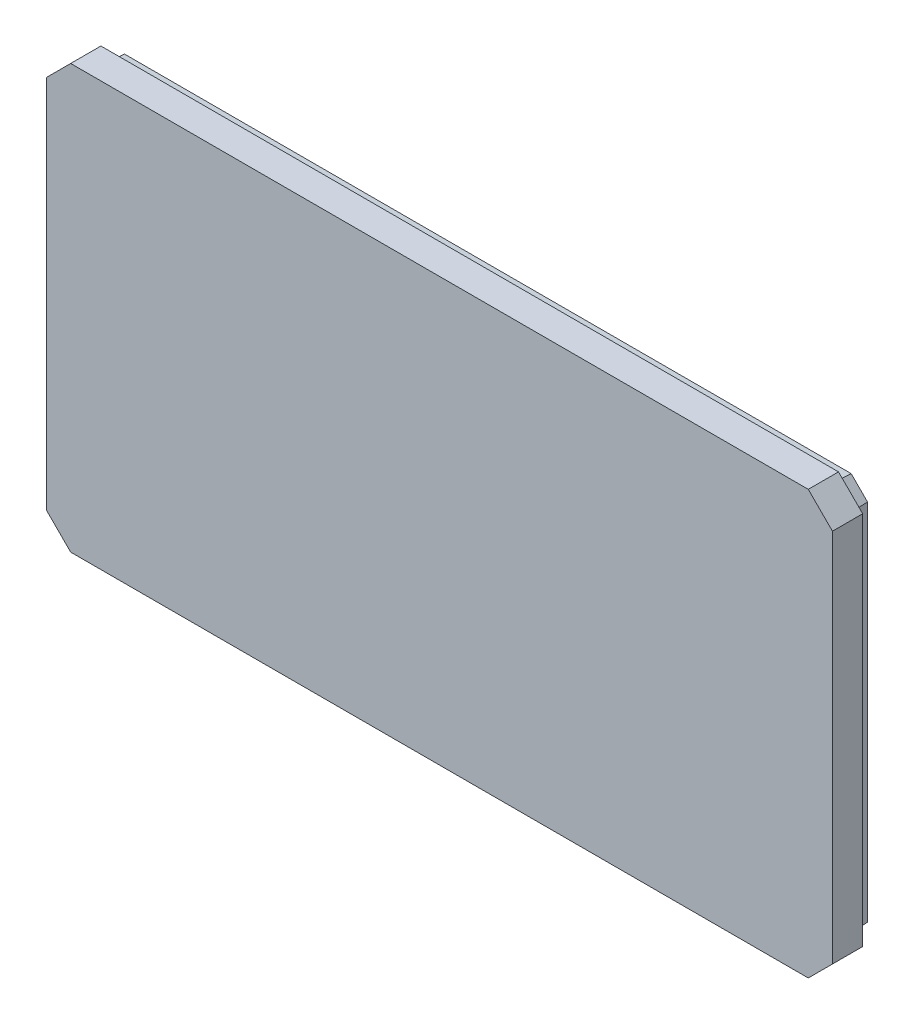
ISO-10303-21;
HEADER;
FILE_DESCRIPTION(('STEP AP214'),'2;1');
FILE_NAME('part.step','',(''),(''),'','','');
FILE_SCHEMA(('AUTOMOTIVE_DESIGN { 1 0 10303 214 1 1 1 1 }'));
ENDSEC;
DATA;
#1=APPLICATION_CONTEXT('core data for automotive mechanical design processes');
#2=APPLICATION_PROTOCOL_DEFINITION('international standard','automotive_design',2000,#1);
#3=PRODUCT_CONTEXT('',#1,'mechanical');
#4=PRODUCT('Part','Part','',(#3));
#5=PRODUCT_RELATED_PRODUCT_CATEGORY('part','',(#4));
#6=PRODUCT_DEFINITION_FORMATION('','',#4);
#7=PRODUCT_DEFINITION_CONTEXT('part definition',#1,'design');
#8=PRODUCT_DEFINITION('design','',#6,#7);
#9=PRODUCT_DEFINITION_SHAPE('','',#8);
#10=(LENGTH_UNIT() NAMED_UNIT(*) SI_UNIT(.MILLI.,.METRE.));
#11=(NAMED_UNIT(*) PLANE_ANGLE_UNIT() SI_UNIT($,.RADIAN.));
#12=(NAMED_UNIT(*) SI_UNIT($,.STERADIAN.) SOLID_ANGLE_UNIT());
#13=UNCERTAINTY_MEASURE_WITH_UNIT(LENGTH_MEASURE(1.E-05),#10,'distance_accuracy_value','');
#14=(GEOMETRIC_REPRESENTATION_CONTEXT(3) GLOBAL_UNCERTAINTY_ASSIGNED_CONTEXT((#13)) GLOBAL_UNIT_ASSIGNED_CONTEXT((#10,
#11,#12)) REPRESENTATION_CONTEXT('',''));
#15=CARTESIAN_POINT('',(0.,0.,0.));
#16=DIRECTION('',(0.,0.,1.));
#17=DIRECTION('',(1.,0.,0.));
#18=AXIS2_PLACEMENT_3D('',#15,#16,#17);
#19=CARTESIAN_POINT('',(-31.5,0.,0.));
#20=DIRECTION('',(-0.997785157856609,0.,-0.0665190105237669));
#21=DIRECTION('',(0.,1.,0.));
#22=AXIS2_PLACEMENT_3D('',#19,#20,#21);
#23=PLANE('',#22);
#24=DIRECTION('',(0.,-1.,0.));
#25=VECTOR('',#24,1.);
#26=CARTESIAN_POINT('',(-31.5,0.,0.));
#27=LINE('',#26,#25);
#28=CARTESIAN_POINT('',(-31.5,-1.05,0.));
#29=VERTEX_POINT('',#28);
#30=CARTESIAN_POINT('',(-31.5,-15.0857864376269,0.));
#31=VERTEX_POINT('',#30);
#32=EDGE_CURVE('E347',#29,#31,#27,.T.);
#33=ORIENTED_EDGE('',*,*,#32,.F.);
#34=DIRECTION('',(0.0665190105237669,0.,-0.997785157856609));
#35=VECTOR('',#34,1.);
#36=CARTESIAN_POINT('',(-31.5,-1.05,0.));
#37=LINE('',#36,#35);
#38=CARTESIAN_POINT('',(-31.46,-1.05,-0.6));
#39=VERTEX_POINT('',#38);
#40=EDGE_CURVE('E11',#29,#39,#37,.T.);
#41=ORIENTED_EDGE('',*,*,#40,.T.);
#42=DIRECTION('',(0.,-1.,0.));
#43=VECTOR('',#42,1.);
#44=CARTESIAN_POINT('',(-31.46,0.,-0.6));
#45=LINE('',#44,#43);
#46=CARTESIAN_POINT('',(-31.46,1.05,-0.6));
#47=VERTEX_POINT('',#46);
#48=EDGE_CURVE('E491',#47,#39,#45,.T.);
#49=ORIENTED_EDGE('',*,*,#48,.F.);
#50=DIRECTION('',(-0.0665190105237669,0.,0.997785157856609));
#51=VECTOR('',#50,1.);
#52=CARTESIAN_POINT('',(-31.5,1.05,0.));
#53=LINE('',#52,#51);
#54=CARTESIAN_POINT('',(-31.5,1.05,0.));
#55=VERTEX_POINT('',#54);
#56=EDGE_CURVE('E43',#47,#55,#53,.T.);
#57=ORIENTED_EDGE('',*,*,#56,.T.);
#58=CARTESIAN_POINT('',(-31.5,15.0857864376269,0.));
#59=VERTEX_POINT('',#58);
#60=EDGE_CURVE('E368',#59,#55,#27,.T.);
#61=ORIENTED_EDGE('',*,*,#60,.F.);
#62=DIRECTION('',(0.0664937752057111,-0.0275426235035928,-0.997406628085773));
#63=VECTOR('',#62,1.);
#64=CARTESIAN_POINT('',(-31.4723716943642,15.0743424187271,-0.414424584536984));
#65=LINE('',#64,#63);
#66=CARTESIAN_POINT('',(-31.4,15.0443650813896,-1.5));
#67=VERTEX_POINT('',#66);
#68=EDGE_CURVE('E475',#67,#59,#65,.F.);
#69=ORIENTED_EDGE('',*,*,#68,.F.);
#70=DIRECTION('',(0.,1.,0.));
#71=VECTOR('',#70,1.);
#72=CARTESIAN_POINT('',(-31.4,15.0857864376269,-1.5));
#73=LINE('',#72,#71);
#74=CARTESIAN_POINT('',(-31.4,-15.0443650813896,-1.5));
#75=VERTEX_POINT('',#74);
#76=EDGE_CURVE('E456',#75,#67,#73,.T.);
#77=ORIENTED_EDGE('',*,*,#76,.F.);
#78=DIRECTION('',(0.0664937752057111,0.0275426235035949,-0.997406628085773));
#79=VECTOR('',#78,1.);
#80=CARTESIAN_POINT('',(-31.4787435185445,-15.0769817147197,-0.31884722183174));
#81=LINE('',#80,#79);
#82=EDGE_CURVE('E481',#75,#31,#81,.F.);
#83=ORIENTED_EDGE('',*,*,#82,.T.);
#84=EDGE_LOOP('',(#33,#41,#49,#57,#61,#69,#77,#83));
#85=FACE_BOUND('',#84,.T.);
#86=ADVANCED_FACE('F35',(#85),#23,.T.);
#87=CARTESIAN_POINT('',(31.5,0.,0.));
#88=DIRECTION('',(0.997785157856609,0.,-0.0665190105237669));
#89=DIRECTION('',(0.,-1.,0.));
#90=AXIS2_PLACEMENT_3D('',#87,#88,#89);
#91=PLANE('',#90);
#92=DIRECTION('',(0.,1.,0.));
#93=VECTOR('',#92,1.);
#94=CARTESIAN_POINT('',(31.46,0.,-0.6));
#95=LINE('',#94,#93);
#96=CARTESIAN_POINT('',(31.46,-1.05,-0.6));
#97=VERTEX_POINT('',#96);
#98=CARTESIAN_POINT('',(31.46,1.05,-0.6));
#99=VERTEX_POINT('',#98);
#100=EDGE_CURVE('E465',#97,#99,#95,.T.);
#101=ORIENTED_EDGE('',*,*,#100,.F.);
#102=DIRECTION('',(0.0665190105237669,0.,0.997785157856609));
#103=VECTOR('',#102,1.);
#104=CARTESIAN_POINT('',(31.5,-1.05,0.));
#105=LINE('',#104,#103);
#106=CARTESIAN_POINT('',(31.5,-1.05,0.));
#107=VERTEX_POINT('',#106);
#108=EDGE_CURVE('E249',#97,#107,#105,.T.);
#109=ORIENTED_EDGE('',*,*,#108,.T.);
#110=DIRECTION('',(0.,1.,0.));
#111=VECTOR('',#110,1.);
#112=CARTESIAN_POINT('',(31.5,0.,0.));
#113=LINE('',#112,#111);
#114=CARTESIAN_POINT('',(31.5,-15.0857864376269,0.));
#115=VERTEX_POINT('',#114);
#116=EDGE_CURVE('E378',#115,#107,#113,.T.);
#117=ORIENTED_EDGE('',*,*,#116,.F.);
#118=DIRECTION('',(0.0664937752057111,-0.0275426235035997,0.997406628085773));
#119=VECTOR('',#118,1.);
#120=CARTESIAN_POINT('',(31.4787435185446,-15.0769817147197,-0.318847221831706));
#121=LINE('',#120,#119);
#122=CARTESIAN_POINT('',(31.4,-15.0443650813896,-1.5));
#123=VERTEX_POINT('',#122);
#124=EDGE_CURVE('E472',#115,#123,#121,.F.);
#125=ORIENTED_EDGE('',*,*,#124,.T.);
#126=DIRECTION('',(0.,-1.,0.));
#127=VECTOR('',#126,1.);
#128=CARTESIAN_POINT('',(31.4,-15.0857864376269,-1.5));
#129=LINE('',#128,#127);
#130=CARTESIAN_POINT('',(31.4,15.0443650813896,-1.5));
#131=VERTEX_POINT('',#130);
#132=EDGE_CURVE('E452',#131,#123,#129,.T.);
#133=ORIENTED_EDGE('',*,*,#132,.F.);
#134=DIRECTION('',(0.0664937752057111,0.0275426235035949,0.997406628085773));
#135=VECTOR('',#134,1.);
#136=CARTESIAN_POINT('',(31.4723716943642,15.0743424187272,-0.414424584537016));
#137=LINE('',#136,#135);
#138=CARTESIAN_POINT('',(31.5,15.0857864376269,0.));
#139=VERTEX_POINT('',#138);
#140=EDGE_CURVE('E467',#139,#131,#137,.F.);
#141=ORIENTED_EDGE('',*,*,#140,.F.);
#142=CARTESIAN_POINT('',(31.5,1.05,0.));
#143=VERTEX_POINT('',#142);
#144=EDGE_CURVE('E377',#143,#139,#113,.T.);
#145=ORIENTED_EDGE('',*,*,#144,.F.);
#146=DIRECTION('',(-0.0665190105237669,0.,-0.997785157856609));
#147=VECTOR('',#146,1.);
#148=CARTESIAN_POINT('',(31.5,1.05,0.));
#149=LINE('',#148,#147);
#150=EDGE_CURVE('E487',#143,#99,#149,.T.);
#151=ORIENTED_EDGE('',*,*,#150,.T.);
#152=EDGE_LOOP('',(#101,#109,#117,#125,#133,#141,#145,#151));
#153=FACE_BOUND('',#152,.T.);
#154=ADVANCED_FACE('F523',(#153),#91,.T.);
#155=CARTESIAN_POINT('',(-32.5,17.5,2.5));
#156=DIRECTION('',(0.,1.,0.));
#157=DIRECTION('',(0.,0.,1.));
#158=AXIS2_PLACEMENT_3D('',#155,#156,#157);
#159=PLANE('',#158);
#160=DIRECTION('',(1.,0.,0.));
#161=VECTOR('',#160,1.);
#162=CARTESIAN_POINT('',(-32.5,17.5,0.));
#163=LINE('',#162,#161);
#164=CARTESIAN_POINT('',(-30.5,17.5,0.));
#165=VERTEX_POINT('',#164);
#166=CARTESIAN_POINT('',(30.5,17.5,0.));
#167=VERTEX_POINT('',#166);
#168=EDGE_CURVE('E388',#165,#167,#163,.T.);
#169=ORIENTED_EDGE('',*,*,#168,.F.);
#170=DIRECTION('',(0.,0.,1.));
#171=VECTOR('',#170,1.);
#172=CARTESIAN_POINT('',(-30.5,17.5,2.5));
#173=LINE('',#172,#171);
#174=CARTESIAN_POINT('',(-30.5,17.5,2.5));
#175=VERTEX_POINT('',#174);
#176=EDGE_CURVE('E441',#165,#175,#173,.T.);
#177=ORIENTED_EDGE('',*,*,#176,.T.);
#178=DIRECTION('',(1.,0.,0.));
#179=VECTOR('',#178,1.);
#180=CARTESIAN_POINT('',(-32.5,17.5,2.5));
#181=LINE('',#180,#179);
#182=CARTESIAN_POINT('',(30.5,17.5,2.5));
#183=VERTEX_POINT('',#182);
#184=EDGE_CURVE('E389',#175,#183,#181,.T.);
#185=ORIENTED_EDGE('',*,*,#184,.T.);
#186=DIRECTION('',(0.,0.,-1.));
#187=VECTOR('',#186,1.);
#188=CARTESIAN_POINT('',(30.5,17.5,0.));
#189=LINE('',#188,#187);
#190=EDGE_CURVE('E438',#183,#167,#189,.T.);
#191=ORIENTED_EDGE('',*,*,#190,.T.);
#192=EDGE_LOOP('',(#169,#177,#185,#191));
#193=FACE_BOUND('',#192,.T.);
#194=ADVANCED_FACE('F558',(#193),#159,.T.);
#195=CARTESIAN_POINT('',(-32.5,-17.5,2.5));
#196=DIRECTION('',(-1.,0.,0.));
#197=DIRECTION('',(0.,0.,1.));
#198=AXIS2_PLACEMENT_3D('',#195,#196,#197);
#199=PLANE('',#198);
#200=DIRECTION('',(0.,1.,0.));
#201=VECTOR('',#200,1.);
#202=CARTESIAN_POINT('',(-32.5,-17.5,0.));
#203=LINE('',#202,#201);
#204=CARTESIAN_POINT('',(-32.5,-15.5,0.));
#205=VERTEX_POINT('',#204);
#206=CARTESIAN_POINT('',(-32.5,15.5,0.));
#207=VERTEX_POINT('',#206);
#208=EDGE_CURVE('E393',#205,#207,#203,.T.);
#209=ORIENTED_EDGE('',*,*,#208,.F.);
#210=DIRECTION('',(0.,0.,1.));
#211=VECTOR('',#210,1.);
#212=CARTESIAN_POINT('',(-32.5,-15.5,2.5));
#213=LINE('',#212,#211);
#214=CARTESIAN_POINT('',(-32.5,-15.5,2.5));
#215=VERTEX_POINT('',#214);
#216=EDGE_CURVE('E428',#205,#215,#213,.T.);
#217=ORIENTED_EDGE('',*,*,#216,.T.);
#218=DIRECTION('',(0.,1.,0.));
#219=VECTOR('',#218,1.);
#220=CARTESIAN_POINT('',(-32.5,-17.5,2.5));
#221=LINE('',#220,#219);
#222=CARTESIAN_POINT('',(-32.5,15.5,2.5));
#223=VERTEX_POINT('',#222);
#224=EDGE_CURVE('E399',#215,#223,#221,.T.);
#225=ORIENTED_EDGE('',*,*,#224,.T.);
#226=DIRECTION('',(0.,0.,-1.));
#227=VECTOR('',#226,1.);
#228=CARTESIAN_POINT('',(-32.5,15.5,2.5));
#229=LINE('',#228,#227);
#230=EDGE_CURVE('E425',#223,#207,#229,.T.);
#231=ORIENTED_EDGE('',*,*,#230,.T.);
#232=EDGE_LOOP('',(#209,#217,#225,#231));
#233=FACE_BOUND('',#232,.T.);
#234=ADVANCED_FACE('F860',(#233),#199,.T.);
#235=CARTESIAN_POINT('',(-32.5,-17.5,2.5));
#236=DIRECTION('',(0.,1.,0.));
#237=DIRECTION('',(0.,0.,1.));
#238=AXIS2_PLACEMENT_3D('',#235,#236,#237);
#239=PLANE('',#238);
#240=DIRECTION('',(1.,0.,0.));
#241=VECTOR('',#240,1.);
#242=CARTESIAN_POINT('',(-32.5,-17.5,2.5));
#243=LINE('',#242,#241);
#244=CARTESIAN_POINT('',(-30.5,-17.5,2.5));
#245=VERTEX_POINT('',#244);
#246=CARTESIAN_POINT('',(30.5,-17.5,2.5));
#247=VERTEX_POINT('',#246);
#248=EDGE_CURVE('E396',#245,#247,#243,.T.);
#249=ORIENTED_EDGE('',*,*,#248,.F.);
#250=DIRECTION('',(0.,0.,-1.));
#251=VECTOR('',#250,1.);
#252=CARTESIAN_POINT('',(-30.5,-17.5,0.));
#253=LINE('',#252,#251);
#254=CARTESIAN_POINT('',(-30.5,-17.5,0.));
#255=VERTEX_POINT('',#254);
#256=EDGE_CURVE('E414',#245,#255,#253,.T.);
#257=ORIENTED_EDGE('',*,*,#256,.T.);
#258=DIRECTION('',(1.,0.,0.));
#259=VECTOR('',#258,1.);
#260=CARTESIAN_POINT('',(-32.5,-17.5,0.));
#261=LINE('',#260,#259);
#262=CARTESIAN_POINT('',(30.5,-17.5,0.));
#263=VERTEX_POINT('',#262);
#264=EDGE_CURVE('E408',#255,#263,#261,.T.);
#265=ORIENTED_EDGE('',*,*,#264,.T.);
#266=DIRECTION('',(0.,0.,1.));
#267=VECTOR('',#266,1.);
#268=CARTESIAN_POINT('',(30.5,-17.5,2.5));
#269=LINE('',#268,#267);
#270=EDGE_CURVE('E402',#263,#247,#269,.T.);
#271=ORIENTED_EDGE('',*,*,#270,.T.);
#272=EDGE_LOOP('',(#249,#257,#265,#271));
#273=FACE_BOUND('',#272,.T.);
#274=ADVANCED_FACE('F599',(#273),#239,.F.);
#275=CARTESIAN_POINT('',(32.5,-17.5,2.5));
#276=DIRECTION('',(-1.,0.,0.));
#277=DIRECTION('',(0.,0.,1.));
#278=AXIS2_PLACEMENT_3D('',#275,#276,#277);
#279=PLANE('',#278);
#280=DIRECTION('',(0.,1.,0.));
#281=VECTOR('',#280,1.);
#282=CARTESIAN_POINT('',(32.5,-17.5,0.));
#283=LINE('',#282,#281);
#284=CARTESIAN_POINT('',(32.5,-15.5,0.));
#285=VERTEX_POINT('',#284);
#286=CARTESIAN_POINT('',(32.5,15.5,0.));
#287=VERTEX_POINT('',#286);
#288=EDGE_CURVE('E405',#285,#287,#283,.T.);
#289=ORIENTED_EDGE('',*,*,#288,.T.);
#290=DIRECTION('',(0.,0.,1.));
#291=VECTOR('',#290,1.);
#292=CARTESIAN_POINT('',(32.5,15.5,2.5));
#293=LINE('',#292,#291);
#294=CARTESIAN_POINT('',(32.5,15.5,2.5));
#295=VERTEX_POINT('',#294);
#296=EDGE_CURVE('E446',#287,#295,#293,.T.);
#297=ORIENTED_EDGE('',*,*,#296,.T.);
#298=DIRECTION('',(0.,1.,0.));
#299=VECTOR('',#298,1.);
#300=CARTESIAN_POINT('',(32.5,-17.5,2.5));
#301=LINE('',#300,#299);
#302=CARTESIAN_POINT('',(32.5,-15.5,2.5));
#303=VERTEX_POINT('',#302);
#304=EDGE_CURVE('E392',#303,#295,#301,.T.);
#305=ORIENTED_EDGE('',*,*,#304,.F.);
#306=DIRECTION('',(0.,0.,-1.));
#307=VECTOR('',#306,1.);
#308=CARTESIAN_POINT('',(32.5,-15.5,2.5));
#309=LINE('',#308,#307);
#310=EDGE_CURVE('E443',#303,#285,#309,.T.);
#311=ORIENTED_EDGE('',*,*,#310,.T.);
#312=EDGE_LOOP('',(#289,#297,#305,#311));
#313=FACE_BOUND('',#312,.T.);
#314=ADVANCED_FACE('F594',(#313),#279,.F.);
#315=CARTESIAN_POINT('',(0.,0.,2.5));
#316=DIRECTION('',(0.,0.,1.));
#317=DIRECTION('',(1.,0.,0.));
#318=AXIS2_PLACEMENT_3D('',#315,#316,#317);
#319=PLANE('',#318);
#320=ORIENTED_EDGE('',*,*,#224,.F.);
#321=DIRECTION('',(0.707106781186546,-0.707106781186549,0.));
#322=VECTOR('',#321,1.);
#323=CARTESIAN_POINT('',(-24.,-24.,2.5));
#324=LINE('',#323,#322);
#325=EDGE_CURVE('E436',#215,#245,#324,.T.);
#326=ORIENTED_EDGE('',*,*,#325,.T.);
#327=ORIENTED_EDGE('',*,*,#248,.T.);
#328=DIRECTION('',(-0.707106781186548,-0.707106781186548,0.));
#329=VECTOR('',#328,1.);
#330=CARTESIAN_POINT('',(24.,-24.,2.5));
#331=LINE('',#330,#329);
#332=EDGE_CURVE('E430',#247,#303,#331,.F.);
#333=ORIENTED_EDGE('',*,*,#332,.T.);
#334=ORIENTED_EDGE('',*,*,#304,.T.);
#335=DIRECTION('',(-0.707106781186545,0.70710678118655,0.));
#336=VECTOR('',#335,1.);
#337=CARTESIAN_POINT('',(24.0000000000001,23.9999999999999,2.5));
#338=LINE('',#337,#336);
#339=EDGE_CURVE('E432',#295,#183,#338,.T.);
#340=ORIENTED_EDGE('',*,*,#339,.T.);
#341=ORIENTED_EDGE('',*,*,#184,.F.);
#342=DIRECTION('',(0.707106781186549,0.707106781186546,0.));
#343=VECTOR('',#342,1.);
#344=CARTESIAN_POINT('',(-23.9999999999999,24.,2.5));
#345=LINE('',#344,#343);
#346=EDGE_CURVE('E434',#175,#223,#345,.F.);
#347=ORIENTED_EDGE('',*,*,#346,.T.);
#348=EDGE_LOOP('',(#320,#326,#327,#333,#334,#340,#341,#347));
#349=FACE_BOUND('',#348,.T.);
#350=ADVANCED_FACE('F584',(#349),#319,.T.);
#351=CARTESIAN_POINT('',(0.,0.,0.));
#352=DIRECTION('',(0.,0.,1.));
#353=DIRECTION('',(1.,0.,0.));
#354=AXIS2_PLACEMENT_3D('',#351,#352,#353);
#355=PLANE('',#354);
#356=ORIENTED_EDGE('',*,*,#116,.T.);
#357=DIRECTION('',(-1.,0.,0.));
#358=VECTOR('',#357,1.);
#359=CARTESIAN_POINT('',(30.95,-1.05,0.));
#360=LINE('',#359,#358);
#361=CARTESIAN_POINT('',(30.95,-1.05,0.));
#362=VERTEX_POINT('',#361);
#363=EDGE_CURVE('E270',#107,#362,#360,.T.);
#364=ORIENTED_EDGE('',*,*,#363,.T.);
#365=DIRECTION('',(0.,1.,0.));
#366=VECTOR('',#365,1.);
#367=CARTESIAN_POINT('',(30.95,-1.05,0.));
#368=LINE('',#367,#366);
#369=CARTESIAN_POINT('',(30.95,1.05,0.));
#370=VERTEX_POINT('',#369);
#371=EDGE_CURVE('E259',#362,#370,#368,.T.);
#372=ORIENTED_EDGE('',*,*,#371,.T.);
#373=DIRECTION('',(1.,0.,0.));
#374=VECTOR('',#373,1.);
#375=CARTESIAN_POINT('',(30.95,1.05,0.));
#376=LINE('',#375,#374);
#377=EDGE_CURVE('E57',#370,#143,#376,.T.);
#378=ORIENTED_EDGE('',*,*,#377,.T.);
#379=ORIENTED_EDGE('',*,*,#144,.T.);
#380=DIRECTION('',(-0.707106781186545,0.70710678118655,0.));
#381=VECTOR('',#380,1.);
#382=CARTESIAN_POINT('',(23.2928932188135,23.2928932188134,0.));
#383=LINE('',#382,#381);
#384=CARTESIAN_POINT('',(30.0857864376269,16.5,0.));
#385=VERTEX_POINT('',#384);
#386=EDGE_CURVE('E381',#139,#385,#383,.T.);
#387=ORIENTED_EDGE('',*,*,#386,.T.);
#388=DIRECTION('',(-1.,0.,0.));
#389=VECTOR('',#388,1.);
#390=CARTESIAN_POINT('',(0.,16.5,0.));
#391=LINE('',#390,#389);
#392=CARTESIAN_POINT('',(-30.0857864376269,16.5,0.));
#393=VERTEX_POINT('',#392);
#394=EDGE_CURVE('E384',#385,#393,#391,.T.);
#395=ORIENTED_EDGE('',*,*,#394,.T.);
#396=DIRECTION('',(-0.707106781186549,-0.707106781186546,0.));
#397=VECTOR('',#396,1.);
#398=CARTESIAN_POINT('',(-23.2928932188134,23.2928932188135,0.));
#399=LINE('',#398,#397);
#400=EDGE_CURVE('E386',#393,#59,#399,.T.);
#401=ORIENTED_EDGE('',*,*,#400,.T.);
#402=ORIENTED_EDGE('',*,*,#60,.T.);
#403=DIRECTION('',(1.,0.,0.));
#404=VECTOR('',#403,1.);
#405=CARTESIAN_POINT('',(-32.05,1.05,0.));
#406=LINE('',#405,#404);
#407=CARTESIAN_POINT('',(-30.95,1.05,0.));
#408=VERTEX_POINT('',#407);
#409=EDGE_CURVE('E280',#55,#408,#406,.T.);
#410=ORIENTED_EDGE('',*,*,#409,.T.);
#411=DIRECTION('',(0.,-1.,0.));
#412=VECTOR('',#411,1.);
#413=CARTESIAN_POINT('',(-30.95,-1.05,0.));
#414=LINE('',#413,#412);
#415=CARTESIAN_POINT('',(-30.95,-1.05,0.));
#416=VERTEX_POINT('',#415);
#417=EDGE_CURVE('E286',#408,#416,#414,.T.);
#418=ORIENTED_EDGE('',*,*,#417,.T.);
#419=DIRECTION('',(-1.,0.,0.));
#420=VECTOR('',#419,1.);
#421=CARTESIAN_POINT('',(-32.05,-1.05,0.));
#422=LINE('',#421,#420);
#423=EDGE_CURVE('E50',#416,#29,#422,.T.);
#424=ORIENTED_EDGE('',*,*,#423,.T.);
#425=ORIENTED_EDGE('',*,*,#32,.T.);
#426=DIRECTION('',(0.707106781186546,-0.707106781186549,0.));
#427=VECTOR('',#426,1.);
#428=CARTESIAN_POINT('',(-23.2928932188135,-23.2928932188134,0.));
#429=LINE('',#428,#427);
#430=CARTESIAN_POINT('',(-30.0857864376269,-16.5,0.));
#431=VERTEX_POINT('',#430);
#432=EDGE_CURVE('E371',#31,#431,#429,.T.);
#433=ORIENTED_EDGE('',*,*,#432,.T.);
#434=DIRECTION('',(1.,0.,0.));
#435=VECTOR('',#434,1.);
#436=CARTESIAN_POINT('',(0.,-16.5,0.));
#437=LINE('',#436,#435);
#438=CARTESIAN_POINT('',(30.0857864376269,-16.5,0.));
#439=VERTEX_POINT('',#438);
#440=EDGE_CURVE('E373',#431,#439,#437,.T.);
#441=ORIENTED_EDGE('',*,*,#440,.T.);
#442=DIRECTION('',(0.707106781186548,0.707106781186548,0.));
#443=VECTOR('',#442,1.);
#444=CARTESIAN_POINT('',(23.2928932188135,-23.2928932188135,0.));
#445=LINE('',#444,#443);
#446=EDGE_CURVE('E375',#439,#115,#445,.T.);
#447=ORIENTED_EDGE('',*,*,#446,.T.);
#448=EDGE_LOOP('',(#356,#364,#372,#378,#379,#387,#395,#401,#402,#410,#418,#424,#425,#433,#441,#447));
#449=FACE_BOUND('',#448,.T.);
#450=ORIENTED_EDGE('',*,*,#264,.F.);
#451=DIRECTION('',(-0.707106781186546,0.707106781186549,0.));
#452=VECTOR('',#451,1.);
#453=CARTESIAN_POINT('',(-30.5,-17.5,0.));
#454=LINE('',#453,#452);
#455=EDGE_CURVE('E423',#255,#205,#454,.T.);
#456=ORIENTED_EDGE('',*,*,#455,.T.);
#457=ORIENTED_EDGE('',*,*,#208,.T.);
#458=DIRECTION('',(-0.707106781186549,-0.707106781186546,0.));
#459=VECTOR('',#458,1.);
#460=CARTESIAN_POINT('',(-32.5,15.5,0.));
#461=LINE('',#460,#459);
#462=EDGE_CURVE('E421',#207,#165,#461,.F.);
#463=ORIENTED_EDGE('',*,*,#462,.T.);
#464=ORIENTED_EDGE('',*,*,#168,.T.);
#465=DIRECTION('',(0.707106781186545,-0.70710678118655,0.));
#466=VECTOR('',#465,1.);
#467=CARTESIAN_POINT('',(30.5,17.5,0.));
#468=LINE('',#467,#466);
#469=EDGE_CURVE('E419',#167,#287,#468,.T.);
#470=ORIENTED_EDGE('',*,*,#469,.T.);
#471=ORIENTED_EDGE('',*,*,#288,.F.);
#472=DIRECTION('',(0.707106781186548,0.707106781186548,0.));
#473=VECTOR('',#472,1.);
#474=CARTESIAN_POINT('',(32.5,-15.5,0.));
#475=LINE('',#474,#473);
#476=EDGE_CURVE('E417',#285,#263,#475,.F.);
#477=ORIENTED_EDGE('',*,*,#476,.T.);
#478=EDGE_LOOP('',(#450,#456,#457,#463,#464,#470,#471,#477));
#479=FACE_BOUND('',#478,.T.);
#480=ADVANCED_FACE('F500',(#449,#479),#355,.F.);
#481=CARTESIAN_POINT('',(-30.5,-17.5,2.5));
#482=DIRECTION('',(-0.707106781186549,-0.707106781186546,0.));
#483=DIRECTION('',(0.,0.,1.));
#484=AXIS2_PLACEMENT_3D('',#481,#482,#483);
#485=PLANE('',#484);
#486=ORIENTED_EDGE('',*,*,#325,.F.);
#487=ORIENTED_EDGE('',*,*,#216,.F.);
#488=ORIENTED_EDGE('',*,*,#455,.F.);
#489=ORIENTED_EDGE('',*,*,#256,.F.);
#490=EDGE_LOOP('',(#486,#487,#488,#489));
#491=FACE_BOUND('',#490,.T.);
#492=ADVANCED_FACE('F583',(#491),#485,.T.);
#493=CARTESIAN_POINT('',(-32.5,15.5,2.5));
#494=DIRECTION('',(0.707106781186546,-0.707106781186549,0.));
#495=DIRECTION('',(0.,0.,-1.));
#496=AXIS2_PLACEMENT_3D('',#493,#494,#495);
#497=PLANE('',#496);
#498=ORIENTED_EDGE('',*,*,#346,.F.);
#499=ORIENTED_EDGE('',*,*,#176,.F.);
#500=ORIENTED_EDGE('',*,*,#462,.F.);
#501=ORIENTED_EDGE('',*,*,#230,.F.);
#502=EDGE_LOOP('',(#498,#499,#500,#501));
#503=FACE_BOUND('',#502,.T.);
#504=ADVANCED_FACE('F590',(#503),#497,.F.);
#505=CARTESIAN_POINT('',(30.5,17.5,2.5));
#506=DIRECTION('',(0.70710678118655,0.707106781186545,0.));
#507=DIRECTION('',(0.,0.,1.));
#508=AXIS2_PLACEMENT_3D('',#505,#506,#507);
#509=PLANE('',#508);
#510=ORIENTED_EDGE('',*,*,#339,.F.);
#511=ORIENTED_EDGE('',*,*,#296,.F.);
#512=ORIENTED_EDGE('',*,*,#469,.F.);
#513=ORIENTED_EDGE('',*,*,#190,.F.);
#514=EDGE_LOOP('',(#510,#511,#512,#513));
#515=FACE_BOUND('',#514,.T.);
#516=ADVANCED_FACE('F749',(#515),#509,.T.);
#517=CARTESIAN_POINT('',(32.5,-15.5,2.5));
#518=DIRECTION('',(-0.707106781186547,0.707106781186547,0.));
#519=DIRECTION('',(0.,0.,-1.));
#520=AXIS2_PLACEMENT_3D('',#517,#518,#519);
#521=PLANE('',#520);
#522=ORIENTED_EDGE('',*,*,#332,.F.);
#523=ORIENTED_EDGE('',*,*,#270,.F.);
#524=ORIENTED_EDGE('',*,*,#476,.F.);
#525=ORIENTED_EDGE('',*,*,#310,.F.);
#526=EDGE_LOOP('',(#522,#523,#524,#525));
#527=FACE_BOUND('',#526,.T.);
#528=ADVANCED_FACE('F607',(#527),#521,.F.);
#529=CARTESIAN_POINT('',(0.,0.,-1.5));
#530=DIRECTION('',(0.,0.,1.));
#531=DIRECTION('',(1.,0.,0.));
#532=AXIS2_PLACEMENT_3D('',#529,#530,#531);
#533=PLANE('',#532);
#534=DIRECTION('',(1.,0.,0.));
#535=VECTOR('',#534,1.);
#536=CARTESIAN_POINT('',(30.0857864376269,16.4,-1.5));
#537=LINE('',#536,#535);
#538=CARTESIAN_POINT('',(-30.0443650813896,16.4,-1.5));
#539=VERTEX_POINT('',#538);
#540=CARTESIAN_POINT('',(30.0443650813896,16.4,-1.5));
#541=VERTEX_POINT('',#540);
#542=EDGE_CURVE('E460',#539,#541,#537,.T.);
#543=ORIENTED_EDGE('',*,*,#542,.T.);
#544=DIRECTION('',(0.707106781186545,-0.70710678118655,0.));
#545=VECTOR('',#544,1.);
#546=CARTESIAN_POINT('',(31.4292893218814,15.0150757595082,-1.5));
#547=LINE('',#546,#545);
#548=EDGE_CURVE('E462',#541,#131,#547,.T.);
#549=ORIENTED_EDGE('',*,*,#548,.T.);
#550=ORIENTED_EDGE('',*,*,#132,.T.);
#551=DIRECTION('',(-0.707106781186548,-0.707106781186548,0.));
#552=VECTOR('',#551,1.);
#553=CARTESIAN_POINT('',(30.0150757595083,-16.4292893218813,-1.5));
#554=LINE('',#553,#552);
#555=CARTESIAN_POINT('',(30.0443650813896,-16.4,-1.5));
#556=VERTEX_POINT('',#555);
#557=EDGE_CURVE('E450',#123,#556,#554,.T.);
#558=ORIENTED_EDGE('',*,*,#557,.T.);
#559=DIRECTION('',(-1.,0.,0.));
#560=VECTOR('',#559,1.);
#561=CARTESIAN_POINT('',(-30.0857864376269,-16.4,-1.5));
#562=LINE('',#561,#560);
#563=CARTESIAN_POINT('',(-30.0443650813896,-16.4,-1.5));
#564=VERTEX_POINT('',#563);
#565=EDGE_CURVE('E448',#556,#564,#562,.T.);
#566=ORIENTED_EDGE('',*,*,#565,.T.);
#567=DIRECTION('',(-0.707106781186546,0.707106781186549,0.));
#568=VECTOR('',#567,1.);
#569=CARTESIAN_POINT('',(-31.4292893218813,-15.0150757595082,-1.5));
#570=LINE('',#569,#568);
#571=EDGE_CURVE('E454',#564,#75,#570,.T.);
#572=ORIENTED_EDGE('',*,*,#571,.T.);
#573=ORIENTED_EDGE('',*,*,#76,.T.);
#574=DIRECTION('',(0.707106781186549,0.707106781186546,0.));
#575=VECTOR('',#574,1.);
#576=CARTESIAN_POINT('',(-30.0150757595082,16.4292893218813,-1.5));
#577=LINE('',#576,#575);
#578=EDGE_CURVE('E458',#67,#539,#577,.T.);
#579=ORIENTED_EDGE('',*,*,#578,.T.);
#580=EDGE_LOOP('',(#543,#549,#550,#558,#566,#572,#573,#579));
#581=FACE_BOUND('',#580,.T.);
#582=DIRECTION('',(-0.707106781186549,-0.707106781186546,0.));
#583=VECTOR('',#582,1.);
#584=CARTESIAN_POINT('',(-22.5857864376268,22.5857864376269,-1.5));
#585=LINE('',#584,#583);
#586=CARTESIAN_POINT('',(-29.6715728752538,15.5,-1.5));
#587=VERTEX_POINT('',#586);
#588=CARTESIAN_POINT('',(-30.5,14.6715728752538,-1.5));
#589=VERTEX_POINT('',#588);
#590=EDGE_CURVE('E316',#587,#589,#585,.T.);
#591=ORIENTED_EDGE('',*,*,#590,.T.);
#592=DIRECTION('',(0.,-1.,0.));
#593=VECTOR('',#592,1.);
#594=CARTESIAN_POINT('',(-30.5,0.,-1.5));
#595=LINE('',#594,#593);
#596=CARTESIAN_POINT('',(-30.5,-14.6715728752538,-1.5));
#597=VERTEX_POINT('',#596);
#598=EDGE_CURVE('E294',#589,#597,#595,.T.);
#599=ORIENTED_EDGE('',*,*,#598,.T.);
#600=DIRECTION('',(0.707106781186545,-0.70710678118655,0.));
#601=VECTOR('',#600,1.);
#602=CARTESIAN_POINT('',(-22.585786437627,-22.5857864376269,-1.5));
#603=LINE('',#602,#601);
#604=CARTESIAN_POINT('',(-29.6715728752538,-15.5,-1.5));
#605=VERTEX_POINT('',#604);
#606=EDGE_CURVE('E297',#597,#605,#603,.T.);
#607=ORIENTED_EDGE('',*,*,#606,.T.);
#608=DIRECTION('',(1.,0.,0.));
#609=VECTOR('',#608,1.);
#610=CARTESIAN_POINT('',(0.,-15.5,-1.5));
#611=LINE('',#610,#609);
#612=CARTESIAN_POINT('',(29.6715728752538,-15.5,-1.5));
#613=VERTEX_POINT('',#612);
#614=EDGE_CURVE('E301',#605,#613,#611,.T.);
#615=ORIENTED_EDGE('',*,*,#614,.T.);
#616=DIRECTION('',(0.707106781186547,0.707106781186548,0.));
#617=VECTOR('',#616,1.);
#618=CARTESIAN_POINT('',(22.5857864376269,-22.5857864376269,-1.5));
#619=LINE('',#618,#617);
#620=CARTESIAN_POINT('',(30.5,-14.6715728752538,-1.5));
#621=VERTEX_POINT('',#620);
#622=EDGE_CURVE('E304',#613,#621,#619,.T.);
#623=ORIENTED_EDGE('',*,*,#622,.T.);
#624=DIRECTION('',(0.,1.,0.));
#625=VECTOR('',#624,1.);
#626=CARTESIAN_POINT('',(30.5,0.,-1.5));
#627=LINE('',#626,#625);
#628=CARTESIAN_POINT('',(30.5,14.6715728752538,-1.5));
#629=VERTEX_POINT('',#628);
#630=EDGE_CURVE('E307',#621,#629,#627,.T.);
#631=ORIENTED_EDGE('',*,*,#630,.T.);
#632=DIRECTION('',(-0.707106781186545,0.70710678118655,0.));
#633=VECTOR('',#632,1.);
#634=CARTESIAN_POINT('',(22.585786437627,22.5857864376269,-1.5));
#635=LINE('',#634,#633);
#636=CARTESIAN_POINT('',(29.6715728752538,15.5,-1.5));
#637=VERTEX_POINT('',#636);
#638=EDGE_CURVE('E310',#629,#637,#635,.T.);
#639=ORIENTED_EDGE('',*,*,#638,.T.);
#640=DIRECTION('',(-1.,0.,0.));
#641=VECTOR('',#640,1.);
#642=CARTESIAN_POINT('',(0.,15.5,-1.5));
#643=LINE('',#642,#641);
#644=EDGE_CURVE('E313',#637,#587,#643,.T.);
#645=ORIENTED_EDGE('',*,*,#644,.T.);
#646=EDGE_LOOP('',(#591,#599,#607,#615,#623,#631,#639,#645));
#647=FACE_BOUND('',#646,.T.);
#648=ADVANCED_FACE('F514',(#581,#647),#533,.F.);
#649=CARTESIAN_POINT('',(-30.5,0.,-1.5));
#650=DIRECTION('',(-1.,0.,0.));
#651=DIRECTION('',(0.,-1.,0.));
#652=AXIS2_PLACEMENT_3D('',#649,#650,#651);
#653=PLANE('',#652);
#654=DIRECTION('',(0.,-1.,0.));
#655=VECTOR('',#654,1.);
#656=CARTESIAN_POINT('',(-30.5,0.,0.));
#657=LINE('',#656,#655);
#658=CARTESIAN_POINT('',(-30.5,14.6715728752538,0.));
#659=VERTEX_POINT('',#658);
#660=CARTESIAN_POINT('',(-30.5,-14.6715728752538,0.));
#661=VERTEX_POINT('',#660);
#662=EDGE_CURVE('E320',#659,#661,#657,.T.);
#663=ORIENTED_EDGE('',*,*,#662,.T.);
#664=DIRECTION('',(0.,0.,1.));
#665=VECTOR('',#664,1.);
#666=CARTESIAN_POINT('',(-30.5,-14.6715728752538,-1.5));
#667=LINE('',#666,#665);
#668=EDGE_CURVE('E319',#597,#661,#667,.T.);
#669=ORIENTED_EDGE('',*,*,#668,.F.);
#670=ORIENTED_EDGE('',*,*,#598,.F.);
#671=DIRECTION('',(0.,0.,1.));
#672=VECTOR('',#671,1.);
#673=CARTESIAN_POINT('',(-30.5,14.6715728752538,-1.5));
#674=LINE('',#673,#672);
#675=EDGE_CURVE('E344',#589,#659,#674,.T.);
#676=ORIENTED_EDGE('',*,*,#675,.T.);
#677=EDGE_LOOP('',(#663,#669,#670,#676));
#678=FACE_BOUND('',#677,.T.);
#679=ADVANCED_FACE('F606',(#678),#653,.F.);
#680=CARTESIAN_POINT('',(-22.5857864376268,22.5857864376269,-1.5));
#681=DIRECTION('',(-0.707106781186546,0.707106781186549,0.));
#682=DIRECTION('',(-0.707106781186549,-0.707106781186546,0.));
#683=AXIS2_PLACEMENT_3D('',#680,#681,#682);
#684=PLANE('',#683);
#685=DIRECTION('',(-0.707106781186549,-0.707106781186546,0.));
#686=VECTOR('',#685,1.);
#687=CARTESIAN_POINT('',(-22.5857864376268,22.5857864376269,0.));
#688=LINE('',#687,#686);
#689=CARTESIAN_POINT('',(-29.6715728752538,15.5,0.));
#690=VERTEX_POINT('',#689);
#691=EDGE_CURVE('E298',#690,#659,#688,.T.);
#692=ORIENTED_EDGE('',*,*,#691,.T.);
#693=ORIENTED_EDGE('',*,*,#675,.F.);
#694=ORIENTED_EDGE('',*,*,#590,.F.);
#695=DIRECTION('',(0.,0.,1.));
#696=VECTOR('',#695,1.);
#697=CARTESIAN_POINT('',(-29.6715728752538,15.5,-1.5));
#698=LINE('',#697,#696);
#699=EDGE_CURVE('E348',#587,#690,#698,.T.);
#700=ORIENTED_EDGE('',*,*,#699,.T.);
#701=EDGE_LOOP('',(#692,#693,#694,#700));
#702=FACE_BOUND('',#701,.T.);
#703=ADVANCED_FACE('F609',(#702),#684,.F.);
#704=CARTESIAN_POINT('',(0.,15.5,-1.5));
#705=DIRECTION('',(0.,1.,0.));
#706=DIRECTION('',(-1.,0.,0.));
#707=AXIS2_PLACEMENT_3D('',#704,#705,#706);
#708=PLANE('',#707);
#709=DIRECTION('',(-1.,0.,0.));
#710=VECTOR('',#709,1.);
#711=CARTESIAN_POINT('',(0.,15.5,0.));
#712=LINE('',#711,#710);
#713=CARTESIAN_POINT('',(29.6715728752538,15.5,0.));
#714=VERTEX_POINT('',#713);
#715=EDGE_CURVE('E339',#714,#690,#712,.T.);
#716=ORIENTED_EDGE('',*,*,#715,.T.);
#717=ORIENTED_EDGE('',*,*,#699,.F.);
#718=ORIENTED_EDGE('',*,*,#644,.F.);
#719=DIRECTION('',(0.,0.,1.));
#720=VECTOR('',#719,1.);
#721=CARTESIAN_POINT('',(29.6715728752538,15.5,-1.5));
#722=LINE('',#721,#720);
#723=EDGE_CURVE('E351',#637,#714,#722,.T.);
#724=ORIENTED_EDGE('',*,*,#723,.T.);
#725=EDGE_LOOP('',(#716,#717,#718,#724));
#726=FACE_BOUND('',#725,.T.);
#727=ADVANCED_FACE('F626',(#726),#708,.F.);
#728=CARTESIAN_POINT('',(22.585786437627,22.5857864376269,-1.5));
#729=DIRECTION('',(0.70710678118655,0.707106781186545,0.));
#730=DIRECTION('',(-0.707106781186545,0.70710678118655,0.));
#731=AXIS2_PLACEMENT_3D('',#728,#729,#730);
#732=PLANE('',#731);
#733=DIRECTION('',(-0.707106781186545,0.70710678118655,0.));
#734=VECTOR('',#733,1.);
#735=CARTESIAN_POINT('',(22.585786437627,22.5857864376269,0.));
#736=LINE('',#735,#734);
#737=CARTESIAN_POINT('',(30.5,14.6715728752538,0.));
#738=VERTEX_POINT('',#737);
#739=EDGE_CURVE('E336',#738,#714,#736,.T.);
#740=ORIENTED_EDGE('',*,*,#739,.T.);
#741=ORIENTED_EDGE('',*,*,#723,.F.);
#742=ORIENTED_EDGE('',*,*,#638,.F.);
#743=DIRECTION('',(0.,0.,1.));
#744=VECTOR('',#743,1.);
#745=CARTESIAN_POINT('',(30.5,14.6715728752538,-1.5));
#746=LINE('',#745,#744);
#747=EDGE_CURVE('E354',#629,#738,#746,.T.);
#748=ORIENTED_EDGE('',*,*,#747,.T.);
#749=EDGE_LOOP('',(#740,#741,#742,#748));
#750=FACE_BOUND('',#749,.T.);
#751=ADVANCED_FACE('F622',(#750),#732,.F.);
#752=CARTESIAN_POINT('',(30.5,0.,-1.5));
#753=DIRECTION('',(1.,0.,0.));
#754=DIRECTION('',(0.,0.,-1.));
#755=AXIS2_PLACEMENT_3D('',#752,#753,#754);
#756=PLANE('',#755);
#757=DIRECTION('',(0.,1.,0.));
#758=VECTOR('',#757,1.);
#759=CARTESIAN_POINT('',(30.5,0.,0.));
#760=LINE('',#759,#758);
#761=CARTESIAN_POINT('',(30.5,-14.6715728752538,0.));
#762=VERTEX_POINT('',#761);
#763=EDGE_CURVE('E333',#762,#738,#760,.T.);
#764=ORIENTED_EDGE('',*,*,#763,.T.);
#765=ORIENTED_EDGE('',*,*,#747,.F.);
#766=ORIENTED_EDGE('',*,*,#630,.F.);
#767=DIRECTION('',(0.,0.,1.));
#768=VECTOR('',#767,1.);
#769=CARTESIAN_POINT('',(30.5,-14.6715728752538,-1.5));
#770=LINE('',#769,#768);
#771=EDGE_CURVE('E357',#621,#762,#770,.T.);
#772=ORIENTED_EDGE('',*,*,#771,.T.);
#773=EDGE_LOOP('',(#764,#765,#766,#772));
#774=FACE_BOUND('',#773,.T.);
#775=ADVANCED_FACE('F618',(#774),#756,.F.);
#776=CARTESIAN_POINT('',(22.5857864376269,-22.5857864376269,-1.5));
#777=DIRECTION('',(0.707106781186548,-0.707106781186547,0.));
#778=DIRECTION('',(0.707106781186547,0.707106781186548,0.));
#779=AXIS2_PLACEMENT_3D('',#776,#777,#778);
#780=PLANE('',#779);
#781=DIRECTION('',(0.707106781186547,0.707106781186548,0.));
#782=VECTOR('',#781,1.);
#783=CARTESIAN_POINT('',(22.5857864376269,-22.5857864376269,0.));
#784=LINE('',#783,#782);
#785=CARTESIAN_POINT('',(29.6715728752538,-15.5,0.));
#786=VERTEX_POINT('',#785);
#787=EDGE_CURVE('E330',#786,#762,#784,.T.);
#788=ORIENTED_EDGE('',*,*,#787,.T.);
#789=ORIENTED_EDGE('',*,*,#771,.F.);
#790=ORIENTED_EDGE('',*,*,#622,.F.);
#791=DIRECTION('',(0.,0.,1.));
#792=VECTOR('',#791,1.);
#793=CARTESIAN_POINT('',(29.6715728752538,-15.5,-1.5));
#794=LINE('',#793,#792);
#795=EDGE_CURVE('E360',#613,#786,#794,.T.);
#796=ORIENTED_EDGE('',*,*,#795,.T.);
#797=EDGE_LOOP('',(#788,#789,#790,#796));
#798=FACE_BOUND('',#797,.T.);
#799=ADVANCED_FACE('F614',(#798),#780,.F.);
#800=CARTESIAN_POINT('',(0.,-15.5,-1.5));
#801=DIRECTION('',(0.,-1.,0.));
#802=DIRECTION('',(1.,0.,0.));
#803=AXIS2_PLACEMENT_3D('',#800,#801,#802);
#804=PLANE('',#803);
#805=DIRECTION('',(1.,0.,0.));
#806=VECTOR('',#805,1.);
#807=CARTESIAN_POINT('',(0.,-15.5,0.));
#808=LINE('',#807,#806);
#809=CARTESIAN_POINT('',(-29.6715728752538,-15.5,0.));
#810=VERTEX_POINT('',#809);
#811=EDGE_CURVE('E327',#810,#786,#808,.T.);
#812=ORIENTED_EDGE('',*,*,#811,.T.);
#813=ORIENTED_EDGE('',*,*,#795,.F.);
#814=ORIENTED_EDGE('',*,*,#614,.F.);
#815=DIRECTION('',(0.,0.,1.));
#816=VECTOR('',#815,1.);
#817=CARTESIAN_POINT('',(-29.6715728752538,-15.5,-1.5));
#818=LINE('',#817,#816);
#819=EDGE_CURVE('E363',#605,#810,#818,.T.);
#820=ORIENTED_EDGE('',*,*,#819,.T.);
#821=EDGE_LOOP('',(#812,#813,#814,#820));
#822=FACE_BOUND('',#821,.T.);
#823=ADVANCED_FACE('F577',(#822),#804,.F.);
#824=CARTESIAN_POINT('',(-22.585786437627,-22.5857864376269,-1.5));
#825=DIRECTION('',(-0.70710678118655,-0.707106781186545,0.));
#826=DIRECTION('',(0.707106781186545,-0.70710678118655,0.));
#827=AXIS2_PLACEMENT_3D('',#824,#825,#826);
#828=PLANE('',#827);
#829=DIRECTION('',(0.707106781186545,-0.70710678118655,0.));
#830=VECTOR('',#829,1.);
#831=CARTESIAN_POINT('',(-22.585786437627,-22.5857864376269,0.));
#832=LINE('',#831,#830);
#833=EDGE_CURVE('E323',#661,#810,#832,.T.);
#834=ORIENTED_EDGE('',*,*,#833,.T.);
#835=ORIENTED_EDGE('',*,*,#819,.F.);
#836=ORIENTED_EDGE('',*,*,#606,.F.);
#837=ORIENTED_EDGE('',*,*,#668,.T.);
#838=EDGE_LOOP('',(#834,#835,#836,#837));
#839=FACE_BOUND('',#838,.T.);
#840=ADVANCED_FACE('F571',(#839),#828,.F.);
#841=ORIENTED_EDGE('',*,*,#662,.F.);
#842=ORIENTED_EDGE('',*,*,#691,.F.);
#843=ORIENTED_EDGE('',*,*,#715,.F.);
#844=ORIENTED_EDGE('',*,*,#739,.F.);
#845=ORIENTED_EDGE('',*,*,#763,.F.);
#846=ORIENTED_EDGE('',*,*,#787,.F.);
#847=ORIENTED_EDGE('',*,*,#811,.F.);
#848=ORIENTED_EDGE('',*,*,#833,.F.);
#849=EDGE_LOOP('',(#841,#842,#843,#844,#845,#846,#847,#848));
#850=FACE_BOUND('',#849,.T.);
#851=ADVANCED_FACE('F567',(#850),#355,.F.);
#852=CARTESIAN_POINT('',(-23.2928932188135,-23.2928932188134,0.));
#853=DIRECTION('',(-0.7055406512877,-0.705540651287696,-0.066519010523768));
#854=DIRECTION('',(-0.707106781186546,0.707106781186549,0.));
#855=AXIS2_PLACEMENT_3D('',#852,#853,#854);
#856=PLANE('',#855);
#857=ORIENTED_EDGE('',*,*,#82,.F.);
#858=ORIENTED_EDGE('',*,*,#571,.F.);
#859=DIRECTION('',(0.0275426235035928,0.0664937752057134,-0.997406628085773));
#860=VECTOR('',#859,1.);
#861=CARTESIAN_POINT('',(-30.0629634770852,-16.4449004991268,-0.826492513097302));
#862=LINE('',#861,#860);
#863=EDGE_CURVE('E324',#431,#564,#862,.T.);
#864=ORIENTED_EDGE('',*,*,#863,.F.);
#865=ORIENTED_EDGE('',*,*,#432,.F.);
#866=EDGE_LOOP('',(#857,#858,#864,#865));
#867=FACE_BOUND('',#866,.T.);
#868=ADVANCED_FACE('F37',(#867),#856,.T.);
#869=CARTESIAN_POINT('',(0.,-16.5,0.));
#870=DIRECTION('',(0.,-0.997785157856609,-0.0665190105237692));
#871=DIRECTION('',(-1.,0.,0.));
#872=AXIS2_PLACEMENT_3D('',#869,#870,#871);
#873=PLANE('',#872);
#874=ORIENTED_EDGE('',*,*,#863,.T.);
#875=ORIENTED_EDGE('',*,*,#565,.F.);
#876=DIRECTION('',(0.0275426235035973,-0.0664937752057134,0.997406628085773));
#877=VECTOR('',#876,1.);
#878=CARTESIAN_POINT('',(30.0629634770853,-16.4449004991268,-0.826492513097437));
#879=LINE('',#878,#877);
#880=EDGE_CURVE('E478',#439,#556,#879,.F.);
#881=ORIENTED_EDGE('',*,*,#880,.F.);
#882=ORIENTED_EDGE('',*,*,#440,.F.);
#883=EDGE_LOOP('',(#874,#875,#881,#882));
#884=FACE_BOUND('',#883,.T.);
#885=ADVANCED_FACE('F534',(#884),#873,.T.);
#886=CARTESIAN_POINT('',(23.2928932188135,-23.2928932188135,0.));
#887=DIRECTION('',(0.705540651287698,-0.705540651287698,-0.0665190105237713));
#888=DIRECTION('',(-0.707106781186548,-0.707106781186548,0.));
#889=AXIS2_PLACEMENT_3D('',#886,#887,#888);
#890=PLANE('',#889);
#891=ORIENTED_EDGE('',*,*,#880,.T.);
#892=ORIENTED_EDGE('',*,*,#557,.F.);
#893=ORIENTED_EDGE('',*,*,#124,.F.);
#894=ORIENTED_EDGE('',*,*,#446,.F.);
#895=EDGE_LOOP('',(#891,#892,#893,#894));
#896=FACE_BOUND('',#895,.T.);
#897=ADVANCED_FACE('F529',(#896),#890,.T.);
#898=CARTESIAN_POINT('',(-23.2928932188134,23.2928932188135,0.));
#899=DIRECTION('',(-0.705540651287697,0.7055406512877,-0.0665190105237664));
#900=DIRECTION('',(0.707106781186549,0.707106781186546,0.));
#901=AXIS2_PLACEMENT_3D('',#898,#899,#900);
#902=PLANE('',#901);
#903=ORIENTED_EDGE('',*,*,#68,.T.);
#904=ORIENTED_EDGE('',*,*,#400,.F.);
#905=DIRECTION('',(0.0275426235035904,-0.0664937752057134,-0.997406628085773));
#906=VECTOR('',#905,1.);
#907=CARTESIAN_POINT('',(-30.0930739683152,16.5175936554238,0.26390483135728));
#908=LINE('',#907,#906);
#909=EDGE_CURVE('E469',#539,#393,#908,.F.);
#910=ORIENTED_EDGE('',*,*,#909,.F.);
#911=ORIENTED_EDGE('',*,*,#578,.F.);
#912=EDGE_LOOP('',(#903,#904,#910,#911));
#913=FACE_BOUND('',#912,.T.);
#914=ADVANCED_FACE('F506',(#913),#902,.T.);
#915=CARTESIAN_POINT('',(0.,16.5,0.));
#916=DIRECTION('',(0.,0.997785157856609,-0.0665190105237692));
#917=DIRECTION('',(1.,0.,0.));
#918=AXIS2_PLACEMENT_3D('',#915,#916,#917);
#919=PLANE('',#918);
#920=ORIENTED_EDGE('',*,*,#909,.T.);
#921=ORIENTED_EDGE('',*,*,#394,.F.);
#922=DIRECTION('',(-0.0275426235035929,-0.0664937752057134,-0.997406628085773));
#923=VECTOR('',#922,1.);
#924=CARTESIAN_POINT('',(30.0629634770853,16.4449004991268,-0.826492513097303));
#925=LINE('',#924,#923);
#926=EDGE_CURVE('E260',#541,#385,#925,.F.);
#927=ORIENTED_EDGE('',*,*,#926,.F.);
#928=ORIENTED_EDGE('',*,*,#542,.F.);
#929=EDGE_LOOP('',(#920,#921,#927,#928));
#930=FACE_BOUND('',#929,.T.);
#931=ADVANCED_FACE('F510',(#930),#919,.T.);
#932=CARTESIAN_POINT('',(23.2928932188135,23.2928932188134,0.));
#933=DIRECTION('',(0.7055406512877,0.705540651287696,-0.066519010523768));
#934=DIRECTION('',(0.707106781186545,-0.70710678118655,0.));
#935=AXIS2_PLACEMENT_3D('',#932,#933,#934);
#936=PLANE('',#935);
#937=ORIENTED_EDGE('',*,*,#140,.T.);
#938=ORIENTED_EDGE('',*,*,#548,.F.);
#939=ORIENTED_EDGE('',*,*,#926,.T.);
#940=ORIENTED_EDGE('',*,*,#386,.F.);
#941=EDGE_LOOP('',(#937,#938,#939,#940));
#942=FACE_BOUND('',#941,.T.);
#943=ADVANCED_FACE('F517',(#942),#936,.T.);
#944=CARTESIAN_POINT('',(30.95,-1.05,-0.6));
#945=DIRECTION('',(0.,1.,0.));
#946=DIRECTION('',(0.,0.,1.));
#947=AXIS2_PLACEMENT_3D('',#944,#945,#946);
#948=PLANE('',#947);
#949=DIRECTION('',(-1.,0.,0.));
#950=VECTOR('',#949,1.);
#951=CARTESIAN_POINT('',(30.95,-1.05,-0.6));
#952=LINE('',#951,#950);
#953=CARTESIAN_POINT('',(30.95,-1.05,-0.6));
#954=VERTEX_POINT('',#953);
#955=EDGE_CURVE('E243',#97,#954,#952,.T.);
#956=ORIENTED_EDGE('',*,*,#955,.T.);
#957=DIRECTION('',(0.,0.,1.));
#958=VECTOR('',#957,1.);
#959=CARTESIAN_POINT('',(30.95,-1.05,-0.6));
#960=LINE('',#959,#958);
#961=EDGE_CURVE('E246',#954,#362,#960,.T.);
#962=ORIENTED_EDGE('',*,*,#961,.T.);
#963=ORIENTED_EDGE('',*,*,#363,.F.);
#964=ORIENTED_EDGE('',*,*,#108,.F.);
#965=EDGE_LOOP('',(#956,#962,#963,#964));
#966=FACE_BOUND('',#965,.T.);
#967=ADVANCED_FACE('F245',(#966),#948,.T.);
#968=CARTESIAN_POINT('',(30.95,-1.05,-0.6));
#969=DIRECTION('',(1.,0.,0.));
#970=DIRECTION('',(0.,0.,-1.));
#971=AXIS2_PLACEMENT_3D('',#968,#969,#970);
#972=PLANE('',#971);
#973=ORIENTED_EDGE('',*,*,#371,.F.);
#974=ORIENTED_EDGE('',*,*,#961,.F.);
#975=DIRECTION('',(0.,1.,0.));
#976=VECTOR('',#975,1.);
#977=CARTESIAN_POINT('',(30.95,-1.05,-0.6));
#978=LINE('',#977,#976);
#979=CARTESIAN_POINT('',(30.95,1.05,-0.6));
#980=VERTEX_POINT('',#979);
#981=EDGE_CURVE('E253',#954,#980,#978,.T.);
#982=ORIENTED_EDGE('',*,*,#981,.T.);
#983=DIRECTION('',(0.,0.,1.));
#984=VECTOR('',#983,1.);
#985=CARTESIAN_POINT('',(30.95,1.05,-0.6));
#986=LINE('',#985,#984);
#987=EDGE_CURVE('E261',#980,#370,#986,.T.);
#988=ORIENTED_EDGE('',*,*,#987,.T.);
#989=EDGE_LOOP('',(#973,#974,#982,#988));
#990=FACE_BOUND('',#989,.T.);
#991=ADVANCED_FACE('F256',(#990),#972,.T.);
#992=CARTESIAN_POINT('',(30.95,1.05,-0.6));
#993=DIRECTION('',(0.,-1.,0.));
#994=DIRECTION('',(1.,0.,0.));
#995=AXIS2_PLACEMENT_3D('',#992,#993,#994);
#996=PLANE('',#995);
#997=ORIENTED_EDGE('',*,*,#377,.F.);
#998=ORIENTED_EDGE('',*,*,#987,.F.);
#999=DIRECTION('',(1.,0.,0.));
#1000=VECTOR('',#999,1.);
#1001=CARTESIAN_POINT('',(30.95,1.05,-0.6));
#1002=LINE('',#1001,#1000);
#1003=EDGE_CURVE('E266',#980,#99,#1002,.T.);
#1004=ORIENTED_EDGE('',*,*,#1003,.T.);
#1005=ORIENTED_EDGE('',*,*,#150,.F.);
#1006=EDGE_LOOP('',(#997,#998,#1004,#1005));
#1007=FACE_BOUND('',#1006,.T.);
#1008=ADVANCED_FACE('F542',(#1007),#996,.T.);
#1009=CARTESIAN_POINT('',(0.,0.,-0.6));
#1010=DIRECTION('',(0.,0.,-1.));
#1011=DIRECTION('',(-1.,0.,0.));
#1012=AXIS2_PLACEMENT_3D('',#1009,#1010,#1011);
#1013=PLANE('',#1012);
#1014=ORIENTED_EDGE('',*,*,#100,.T.);
#1015=ORIENTED_EDGE('',*,*,#1003,.F.);
#1016=ORIENTED_EDGE('',*,*,#981,.F.);
#1017=ORIENTED_EDGE('',*,*,#955,.F.);
#1018=EDGE_LOOP('',(#1014,#1015,#1016,#1017));
#1019=FACE_BOUND('',#1018,.T.);
#1020=ADVANCED_FACE('F264',(#1019),#1013,.F.);
#1021=CARTESIAN_POINT('',(-30.95,-1.05,-0.6));
#1022=DIRECTION('',(-1.,0.,0.));
#1023=DIRECTION('',(0.,0.,1.));
#1024=AXIS2_PLACEMENT_3D('',#1021,#1022,#1023);
#1025=PLANE('',#1024);
#1026=ORIENTED_EDGE('',*,*,#417,.F.);
#1027=DIRECTION('',(0.,0.,1.));
#1028=VECTOR('',#1027,1.);
#1029=CARTESIAN_POINT('',(-30.95,1.05,-0.6));
#1030=LINE('',#1029,#1028);
#1031=CARTESIAN_POINT('',(-30.95,1.05,-0.6));
#1032=VERTEX_POINT('',#1031);
#1033=EDGE_CURVE('E285',#1032,#408,#1030,.T.);
#1034=ORIENTED_EDGE('',*,*,#1033,.F.);
#1035=DIRECTION('',(0.,-1.,0.));
#1036=VECTOR('',#1035,1.);
#1037=CARTESIAN_POINT('',(-30.95,-1.05,-0.6));
#1038=LINE('',#1037,#1036);
#1039=CARTESIAN_POINT('',(-30.95,-1.05,-0.6));
#1040=VERTEX_POINT('',#1039);
#1041=EDGE_CURVE('E276',#1032,#1040,#1038,.T.);
#1042=ORIENTED_EDGE('',*,*,#1041,.T.);
#1043=DIRECTION('',(0.,0.,1.));
#1044=VECTOR('',#1043,1.);
#1045=CARTESIAN_POINT('',(-30.95,-1.05,-0.6));
#1046=LINE('',#1045,#1044);
#1047=EDGE_CURVE('E272',#1040,#416,#1046,.T.);
#1048=ORIENTED_EDGE('',*,*,#1047,.T.);
#1049=EDGE_LOOP('',(#1026,#1034,#1042,#1048));
#1050=FACE_BOUND('',#1049,.T.);
#1051=ADVANCED_FACE('F549',(#1050),#1025,.T.);
#1052=CARTESIAN_POINT('',(-32.05,-1.05,-0.6));
#1053=DIRECTION('',(0.,1.,0.));
#1054=DIRECTION('',(-1.,0.,0.));
#1055=AXIS2_PLACEMENT_3D('',#1052,#1053,#1054);
#1056=PLANE('',#1055);
#1057=ORIENTED_EDGE('',*,*,#423,.F.);
#1058=ORIENTED_EDGE('',*,*,#1047,.F.);
#1059=DIRECTION('',(-1.,0.,0.));
#1060=VECTOR('',#1059,1.);
#1061=CARTESIAN_POINT('',(-32.05,-1.05,-0.6));
#1062=LINE('',#1061,#1060);
#1063=EDGE_CURVE('E279',#1040,#39,#1062,.T.);
#1064=ORIENTED_EDGE('',*,*,#1063,.T.);
#1065=ORIENTED_EDGE('',*,*,#40,.F.);
#1066=EDGE_LOOP('',(#1057,#1058,#1064,#1065));
#1067=FACE_BOUND('',#1066,.T.);
#1068=ADVANCED_FACE('F636',(#1067),#1056,.T.);
#1069=CARTESIAN_POINT('',(-32.05,1.05,-0.6));
#1070=DIRECTION('',(0.,-1.,0.));
#1071=DIRECTION('',(1.,0.,0.));
#1072=AXIS2_PLACEMENT_3D('',#1069,#1070,#1071);
#1073=PLANE('',#1072);
#1074=DIRECTION('',(1.,0.,0.));
#1075=VECTOR('',#1074,1.);
#1076=CARTESIAN_POINT('',(-32.05,1.05,-0.6));
#1077=LINE('',#1076,#1075);
#1078=EDGE_CURVE('E283',#47,#1032,#1077,.T.);
#1079=ORIENTED_EDGE('',*,*,#1078,.T.);
#1080=ORIENTED_EDGE('',*,*,#1033,.T.);
#1081=ORIENTED_EDGE('',*,*,#409,.F.);
#1082=ORIENTED_EDGE('',*,*,#56,.F.);
#1083=EDGE_LOOP('',(#1079,#1080,#1081,#1082));
#1084=FACE_BOUND('',#1083,.T.);
#1085=ADVANCED_FACE('F640',(#1084),#1073,.T.);
#1086=CARTESIAN_POINT('',(0.,0.,-0.6));
#1087=DIRECTION('',(0.,0.,-1.));
#1088=DIRECTION('',(-1.,0.,0.));
#1089=AXIS2_PLACEMENT_3D('',#1086,#1087,#1088);
#1090=PLANE('',#1089);
#1091=ORIENTED_EDGE('',*,*,#48,.T.);
#1092=ORIENTED_EDGE('',*,*,#1063,.F.);
#1093=ORIENTED_EDGE('',*,*,#1041,.F.);
#1094=ORIENTED_EDGE('',*,*,#1078,.F.);
#1095=EDGE_LOOP('',(#1091,#1092,#1093,#1094));
#1096=FACE_BOUND('',#1095,.T.);
#1097=ADVANCED_FACE('F644',(#1096),#1090,.F.);
#1098=CLOSED_SHELL('',(#86,#154,#194,#234,#274,#314,#350,#480,#492,#504,#516,#528,#648,#679,
#703,#727,#751,#775,#799,#823,#840,#851,#868,#885,#897,#914,#931,#943,#967,#991,#1008,#1020,
#1051,#1068,#1085,#1097));
#1099=MANIFOLD_SOLID_BREP('B2',#1098);
#1100=ADVANCED_BREP_SHAPE_REPRESENTATION('',(#18,#1099),#14);
#1101=SHAPE_DEFINITION_REPRESENTATION(#9,#1100);
ENDSEC;
END-ISO-10303-21;
